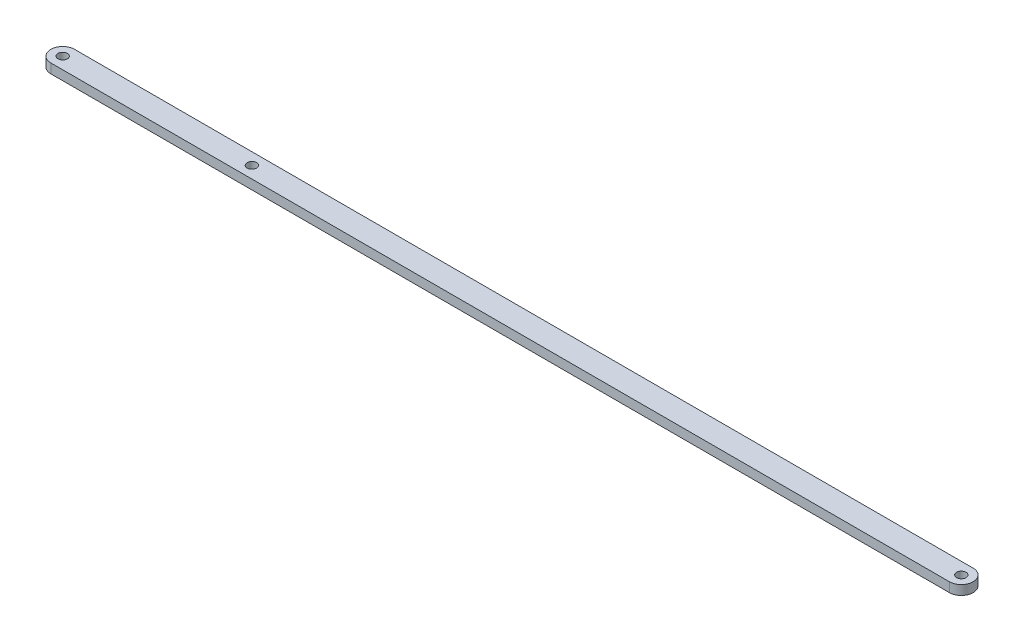
ISO-10303-21;
HEADER;
FILE_DESCRIPTION(('STEP AP214'),'2;1');
FILE_NAME('part.step','',(''),(''),'','','');
FILE_SCHEMA(('AUTOMOTIVE_DESIGN { 1 0 10303 214 1 1 1 1 }'));
ENDSEC;
DATA;
#1=APPLICATION_CONTEXT('core data for automotive mechanical design processes');
#2=APPLICATION_PROTOCOL_DEFINITION('international standard','automotive_design',2000,#1);
#3=PRODUCT_CONTEXT('',#1,'mechanical');
#4=PRODUCT('Part','Part','',(#3));
#5=PRODUCT_RELATED_PRODUCT_CATEGORY('part','',(#4));
#6=PRODUCT_DEFINITION_FORMATION('','',#4);
#7=PRODUCT_DEFINITION_CONTEXT('part definition',#1,'design');
#8=PRODUCT_DEFINITION('design','',#6,#7);
#9=PRODUCT_DEFINITION_SHAPE('','',#8);
#10=(LENGTH_UNIT() NAMED_UNIT(*) SI_UNIT(.MILLI.,.METRE.));
#11=(NAMED_UNIT(*) PLANE_ANGLE_UNIT() SI_UNIT($,.RADIAN.));
#12=(NAMED_UNIT(*) SI_UNIT($,.STERADIAN.) SOLID_ANGLE_UNIT());
#13=UNCERTAINTY_MEASURE_WITH_UNIT(LENGTH_MEASURE(1.E-05),#10,'distance_accuracy_value','');
#14=(GEOMETRIC_REPRESENTATION_CONTEXT(3) GLOBAL_UNCERTAINTY_ASSIGNED_CONTEXT((#13)) GLOBAL_UNIT_ASSIGNED_CONTEXT((#10,
#11,#12)) REPRESENTATION_CONTEXT('',''));
#15=CARTESIAN_POINT('',(0.,0.,0.));
#16=DIRECTION('',(0.,0.,1.));
#17=DIRECTION('',(1.,0.,0.));
#18=AXIS2_PLACEMENT_3D('',#15,#16,#17);
#19=CARTESIAN_POINT('',(-10.,2.,0.));
#20=DIRECTION('',(0.,1.,0.));
#21=DIRECTION('',(0.,0.,1.));
#22=AXIS2_PLACEMENT_3D('',#19,#20,#21);
#23=PLANE('',#22);
#24=CARTESIAN_POINT('',(30.,2.,0.));
#25=DIRECTION('',(0.,1.,0.));
#26=DIRECTION('',(0.,0.,1.));
#27=AXIS2_PLACEMENT_3D('',#24,#25,#26);
#28=CIRCLE('',#27,1.);
#29=CARTESIAN_POINT('',(30.,2.,1.));
#30=VERTEX_POINT('',#29);
#31=EDGE_CURVE('E128',#30,#30,#28,.T.);
#32=ORIENTED_EDGE('',*,*,#31,.F.);
#33=EDGE_LOOP('',(#32));
#34=FACE_BOUND('',#33,.T.);
#35=CARTESIAN_POINT('',(180.,2.,0.));
#36=DIRECTION('',(0.,1.,0.));
#37=DIRECTION('',(0.,0.,1.));
#38=AXIS2_PLACEMENT_3D('',#35,#36,#37);
#39=CIRCLE('',#38,0.999999999999998);
#40=CARTESIAN_POINT('',(180.,2.,0.999999999999998));
#41=VERTEX_POINT('',#40);
#42=EDGE_CURVE('E104',#41,#41,#39,.T.);
#43=ORIENTED_EDGE('',*,*,#42,.F.);
#44=EDGE_LOOP('',(#43));
#45=FACE_BOUND('',#44,.T.);
#46=CARTESIAN_POINT('',(-10.,2.,0.));
#47=DIRECTION('',(0.,1.,0.));
#48=DIRECTION('',(0.,0.,1.));
#49=AXIS2_PLACEMENT_3D('',#46,#47,#48);
#50=CIRCLE('',#49,2.5);
#51=CARTESIAN_POINT('',(-10.,2.,-2.5));
#52=VERTEX_POINT('',#51);
#53=CARTESIAN_POINT('',(-10.,2.,2.5));
#54=VERTEX_POINT('',#53);
#55=EDGE_CURVE('E89',#52,#54,#50,.T.);
#56=ORIENTED_EDGE('',*,*,#55,.T.);
#57=DIRECTION('',(1.,0.,0.));
#58=VECTOR('',#57,1.);
#59=CARTESIAN_POINT('',(-10.,2.,2.5));
#60=LINE('',#59,#58);
#61=CARTESIAN_POINT('',(180.,2.,2.5));
#62=VERTEX_POINT('',#61);
#63=EDGE_CURVE('E84',#54,#62,#60,.T.);
#64=ORIENTED_EDGE('',*,*,#63,.T.);
#65=CARTESIAN_POINT('',(180.,2.,0.));
#66=DIRECTION('',(0.,1.,0.));
#67=DIRECTION('',(0.,0.,1.));
#68=AXIS2_PLACEMENT_3D('',#65,#66,#67);
#69=CIRCLE('',#68,2.5);
#70=CARTESIAN_POINT('',(180.,2.,-2.5));
#71=VERTEX_POINT('',#70);
#72=EDGE_CURVE('E87',#62,#71,#69,.T.);
#73=ORIENTED_EDGE('',*,*,#72,.T.);
#74=DIRECTION('',(-1.,0.,0.));
#75=VECTOR('',#74,1.);
#76=CARTESIAN_POINT('',(-10.,2.,-2.5));
#77=LINE('',#76,#75);
#78=EDGE_CURVE('E54',#71,#52,#77,.T.);
#79=ORIENTED_EDGE('',*,*,#78,.T.);
#80=EDGE_LOOP('',(#56,#64,#73,#79));
#81=FACE_BOUND('',#80,.T.);
#82=CARTESIAN_POINT('',(-10.,2.,0.));
#83=DIRECTION('',(0.,1.,0.));
#84=DIRECTION('',(0.,0.,1.));
#85=AXIS2_PLACEMENT_3D('',#82,#83,#84);
#86=CIRCLE('',#85,1.);
#87=CARTESIAN_POINT('',(-10.,2.,1.));
#88=VERTEX_POINT('',#87);
#89=EDGE_CURVE('E119',#88,#88,#86,.T.);
#90=ORIENTED_EDGE('',*,*,#89,.F.);
#91=EDGE_LOOP('',(#90));
#92=FACE_BOUND('',#91,.T.);
#93=ADVANCED_FACE('F37',(#34,#45,#81,#92),#23,.T.);
#94=CARTESIAN_POINT('',(-10.,0.,0.));
#95=DIRECTION('',(0.,1.,0.));
#96=DIRECTION('',(0.,0.,1.));
#97=AXIS2_PLACEMENT_3D('',#94,#95,#96);
#98=PLANE('',#97);
#99=CARTESIAN_POINT('',(30.,0.,0.));
#100=DIRECTION('',(0.,1.,0.));
#101=DIRECTION('',(0.,0.,1.));
#102=AXIS2_PLACEMENT_3D('',#99,#100,#101);
#103=CIRCLE('',#102,1.);
#104=CARTESIAN_POINT('',(30.,0.,1.));
#105=VERTEX_POINT('',#104);
#106=EDGE_CURVE('E125',#105,#105,#103,.T.);
#107=ORIENTED_EDGE('',*,*,#106,.T.);
#108=EDGE_LOOP('',(#107));
#109=FACE_BOUND('',#108,.T.);
#110=CARTESIAN_POINT('',(-10.,0.,0.));
#111=DIRECTION('',(0.,1.,0.));
#112=DIRECTION('',(0.,0.,1.));
#113=AXIS2_PLACEMENT_3D('',#110,#111,#112);
#114=CIRCLE('',#113,2.5);
#115=CARTESIAN_POINT('',(-10.,0.,-2.5));
#116=VERTEX_POINT('',#115);
#117=CARTESIAN_POINT('',(-10.,0.,2.5));
#118=VERTEX_POINT('',#117);
#119=EDGE_CURVE('E101',#116,#118,#114,.T.);
#120=ORIENTED_EDGE('',*,*,#119,.F.);
#121=DIRECTION('',(-1.,0.,0.));
#122=VECTOR('',#121,1.);
#123=CARTESIAN_POINT('',(-10.,0.,-2.5));
#124=LINE('',#123,#122);
#125=CARTESIAN_POINT('',(180.,0.,-2.5));
#126=VERTEX_POINT('',#125);
#127=EDGE_CURVE('E77',#126,#116,#124,.T.);
#128=ORIENTED_EDGE('',*,*,#127,.F.);
#129=CARTESIAN_POINT('',(180.,0.,0.));
#130=DIRECTION('',(0.,1.,0.));
#131=DIRECTION('',(0.,0.,1.));
#132=AXIS2_PLACEMENT_3D('',#129,#130,#131);
#133=CIRCLE('',#132,2.5);
#134=CARTESIAN_POINT('',(180.,0.,2.5));
#135=VERTEX_POINT('',#134);
#136=EDGE_CURVE('E71',#135,#126,#133,.T.);
#137=ORIENTED_EDGE('',*,*,#136,.F.);
#138=DIRECTION('',(1.,0.,0.));
#139=VECTOR('',#138,1.);
#140=CARTESIAN_POINT('',(-10.,0.,2.5));
#141=LINE('',#140,#139);
#142=EDGE_CURVE('E93',#118,#135,#141,.T.);
#143=ORIENTED_EDGE('',*,*,#142,.F.);
#144=EDGE_LOOP('',(#120,#128,#137,#143));
#145=FACE_BOUND('',#144,.T.);
#146=CARTESIAN_POINT('',(180.,0.,0.));
#147=DIRECTION('',(0.,1.,0.));
#148=DIRECTION('',(0.,0.,1.));
#149=AXIS2_PLACEMENT_3D('',#146,#147,#148);
#150=CIRCLE('',#149,0.999999999999998);
#151=CARTESIAN_POINT('',(180.,0.,0.999999999999998));
#152=VERTEX_POINT('',#151);
#153=EDGE_CURVE('E116',#152,#152,#150,.T.);
#154=ORIENTED_EDGE('',*,*,#153,.T.);
#155=EDGE_LOOP('',(#154));
#156=FACE_BOUND('',#155,.T.);
#157=CARTESIAN_POINT('',(-10.,0.,0.));
#158=DIRECTION('',(0.,1.,0.));
#159=DIRECTION('',(0.,0.,1.));
#160=AXIS2_PLACEMENT_3D('',#157,#158,#159);
#161=CIRCLE('',#160,1.);
#162=CARTESIAN_POINT('',(-10.,0.,1.));
#163=VERTEX_POINT('',#162);
#164=EDGE_CURVE('E122',#163,#163,#161,.T.);
#165=ORIENTED_EDGE('',*,*,#164,.T.);
#166=EDGE_LOOP('',(#165));
#167=FACE_BOUND('',#166,.T.);
#168=ADVANCED_FACE('F112',(#109,#145,#156,#167),#98,.F.);
#169=CARTESIAN_POINT('',(-10.,2.,0.));
#170=DIRECTION('',(0.,-1.,0.));
#171=DIRECTION('',(0.,0.,-1.));
#172=AXIS2_PLACEMENT_3D('',#169,#170,#171);
#173=CYLINDRICAL_SURFACE('',#172,2.5);
#174=ORIENTED_EDGE('',*,*,#119,.T.);
#175=DIRECTION('',(0.,-1.,0.));
#176=VECTOR('',#175,1.);
#177=CARTESIAN_POINT('',(-10.,2.,2.5));
#178=LINE('',#177,#176);
#179=EDGE_CURVE('E11',#54,#118,#178,.T.);
#180=ORIENTED_EDGE('',*,*,#179,.F.);
#181=ORIENTED_EDGE('',*,*,#55,.F.);
#182=DIRECTION('',(0.,-1.,0.));
#183=VECTOR('',#182,1.);
#184=CARTESIAN_POINT('',(-10.,2.,-2.5));
#185=LINE('',#184,#183);
#186=EDGE_CURVE('E97',#52,#116,#185,.T.);
#187=ORIENTED_EDGE('',*,*,#186,.T.);
#188=EDGE_LOOP('',(#174,#180,#181,#187));
#189=FACE_BOUND('',#188,.T.);
#190=ADVANCED_FACE('F39',(#189),#173,.T.);
#191=CARTESIAN_POINT('',(-10.,2.,2.5));
#192=DIRECTION('',(0.,0.,-1.));
#193=DIRECTION('',(-1.,0.,0.));
#194=AXIS2_PLACEMENT_3D('',#191,#192,#193);
#195=PLANE('',#194);
#196=ORIENTED_EDGE('',*,*,#142,.T.);
#197=DIRECTION('',(0.,-1.,0.));
#198=VECTOR('',#197,1.);
#199=CARTESIAN_POINT('',(180.,2.,2.5));
#200=LINE('',#199,#198);
#201=EDGE_CURVE('E46',#62,#135,#200,.T.);
#202=ORIENTED_EDGE('',*,*,#201,.F.);
#203=ORIENTED_EDGE('',*,*,#63,.F.);
#204=ORIENTED_EDGE('',*,*,#179,.T.);
#205=EDGE_LOOP('',(#196,#202,#203,#204));
#206=FACE_BOUND('',#205,.T.);
#207=ADVANCED_FACE('F92',(#206),#195,.F.);
#208=CARTESIAN_POINT('',(180.,2.,0.));
#209=DIRECTION('',(0.,-1.,0.));
#210=DIRECTION('',(0.,0.,-1.));
#211=AXIS2_PLACEMENT_3D('',#208,#209,#210);
#212=CYLINDRICAL_SURFACE('',#211,2.5);
#213=ORIENTED_EDGE('',*,*,#136,.T.);
#214=DIRECTION('',(0.,-1.,0.));
#215=VECTOR('',#214,1.);
#216=CARTESIAN_POINT('',(180.,2.,-2.5));
#217=LINE('',#216,#215);
#218=EDGE_CURVE('E94',#71,#126,#217,.T.);
#219=ORIENTED_EDGE('',*,*,#218,.F.);
#220=ORIENTED_EDGE('',*,*,#72,.F.);
#221=ORIENTED_EDGE('',*,*,#201,.T.);
#222=EDGE_LOOP('',(#213,#219,#220,#221));
#223=FACE_BOUND('',#222,.T.);
#224=ADVANCED_FACE('F95',(#223),#212,.T.);
#225=CARTESIAN_POINT('',(-10.,2.,-2.5));
#226=DIRECTION('',(0.,0.,1.));
#227=DIRECTION('',(1.,0.,0.));
#228=AXIS2_PLACEMENT_3D('',#225,#226,#227);
#229=PLANE('',#228);
#230=ORIENTED_EDGE('',*,*,#127,.T.);
#231=ORIENTED_EDGE('',*,*,#186,.F.);
#232=ORIENTED_EDGE('',*,*,#78,.F.);
#233=ORIENTED_EDGE('',*,*,#218,.T.);
#234=EDGE_LOOP('',(#230,#231,#232,#233));
#235=FACE_BOUND('',#234,.T.);
#236=ADVANCED_FACE('F109',(#235),#229,.F.);
#237=CARTESIAN_POINT('',(180.,2.,0.));
#238=DIRECTION('',(0.,-1.,0.));
#239=DIRECTION('',(0.,0.,-1.));
#240=AXIS2_PLACEMENT_3D('',#237,#238,#239);
#241=CYLINDRICAL_SURFACE('',#240,0.999999999999998);
#242=ORIENTED_EDGE('',*,*,#42,.T.);
#243=EDGE_LOOP('',(#242));
#244=FACE_BOUND('',#243,.T.);
#245=ORIENTED_EDGE('',*,*,#153,.F.);
#246=EDGE_LOOP('',(#245));
#247=FACE_BOUND('',#246,.T.);
#248=ADVANCED_FACE('F147',(#244,#247),#241,.F.);
#249=CARTESIAN_POINT('',(-10.,2.,0.));
#250=DIRECTION('',(0.,-1.,0.));
#251=DIRECTION('',(0.,0.,-1.));
#252=AXIS2_PLACEMENT_3D('',#249,#250,#251);
#253=CYLINDRICAL_SURFACE('',#252,1.);
#254=ORIENTED_EDGE('',*,*,#89,.T.);
#255=EDGE_LOOP('',(#254));
#256=FACE_BOUND('',#255,.T.);
#257=ORIENTED_EDGE('',*,*,#164,.F.);
#258=EDGE_LOOP('',(#257));
#259=FACE_BOUND('',#258,.T.);
#260=ADVANCED_FACE('F138',(#256,#259),#253,.F.);
#261=CARTESIAN_POINT('',(30.,0.,0.));
#262=DIRECTION('',(0.,1.,0.));
#263=DIRECTION('',(0.,0.,1.));
#264=AXIS2_PLACEMENT_3D('',#261,#262,#263);
#265=CYLINDRICAL_SURFACE('',#264,1.);
#266=ORIENTED_EDGE('',*,*,#106,.F.);
#267=EDGE_LOOP('',(#266));
#268=FACE_BOUND('',#267,.T.);
#269=ORIENTED_EDGE('',*,*,#31,.T.);
#270=EDGE_LOOP('',(#269));
#271=FACE_BOUND('',#270,.T.);
#272=ADVANCED_FACE('F135',(#268,#271),#265,.F.);
#273=CLOSED_SHELL('',(#93,#168,#190,#207,#224,#236,#248,#260,#272));
#274=MANIFOLD_SOLID_BREP('B2',#273);
#275=ADVANCED_BREP_SHAPE_REPRESENTATION('',(#18,#274),#14);
#276=SHAPE_DEFINITION_REPRESENTATION(#9,#275);
ENDSEC;
END-ISO-10303-21;
